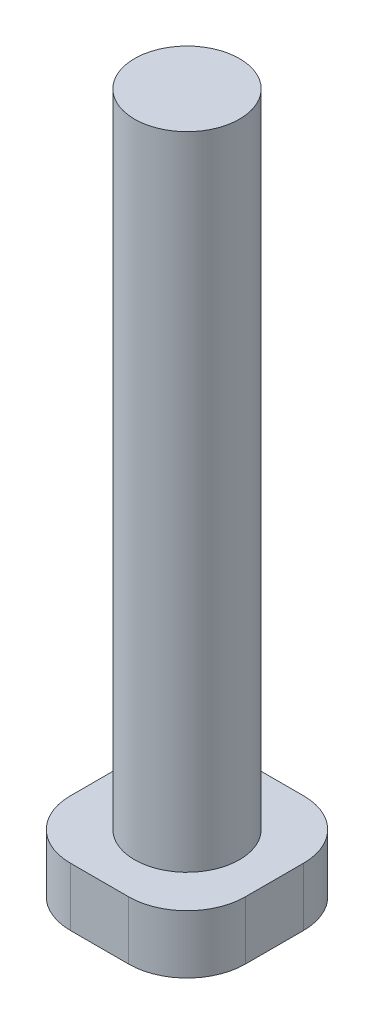
ISO-10303-21;
HEADER;
FILE_DESCRIPTION(('STEP AP214'),'2;1');
FILE_NAME('part.step','',(''),(''),'','','');
FILE_SCHEMA(('AUTOMOTIVE_DESIGN { 1 0 10303 214 1 1 1 1 }'));
ENDSEC;
DATA;
#1=APPLICATION_CONTEXT('core data for automotive mechanical design processes');
#2=APPLICATION_PROTOCOL_DEFINITION('international standard','automotive_design',2000,#1);
#3=PRODUCT_CONTEXT('',#1,'mechanical');
#4=PRODUCT('Part','Part','',(#3));
#5=PRODUCT_RELATED_PRODUCT_CATEGORY('part','',(#4));
#6=PRODUCT_DEFINITION_FORMATION('','',#4);
#7=PRODUCT_DEFINITION_CONTEXT('part definition',#1,'design');
#8=PRODUCT_DEFINITION('design','',#6,#7);
#9=PRODUCT_DEFINITION_SHAPE('','',#8);
#10=(LENGTH_UNIT() NAMED_UNIT(*) SI_UNIT(.MILLI.,.METRE.));
#11=(NAMED_UNIT(*) PLANE_ANGLE_UNIT() SI_UNIT($,.RADIAN.));
#12=(NAMED_UNIT(*) SI_UNIT($,.STERADIAN.) SOLID_ANGLE_UNIT());
#13=UNCERTAINTY_MEASURE_WITH_UNIT(LENGTH_MEASURE(1.E-05),#10,'distance_accuracy_value','');
#14=(GEOMETRIC_REPRESENTATION_CONTEXT(3) GLOBAL_UNCERTAINTY_ASSIGNED_CONTEXT((#13)) GLOBAL_UNIT_ASSIGNED_CONTEXT((#10,
#11,#12)) REPRESENTATION_CONTEXT('',''));
#15=CARTESIAN_POINT('',(0.,0.,0.));
#16=DIRECTION('',(0.,0.,1.));
#17=DIRECTION('',(1.,0.,0.));
#18=AXIS2_PLACEMENT_3D('',#15,#16,#17);
#19=CARTESIAN_POINT('',(0.,30.48,0.));
#20=DIRECTION('',(1.,0.,0.));
#21=DIRECTION('',(0.,0.,-1.));
#22=AXIS2_PLACEMENT_3D('',#19,#20,#21);
#23=PLANE('',#22);
#24=DIRECTION('',(0.,0.,1.));
#25=VECTOR('',#24,1.);
#26=CARTESIAN_POINT('',(0.,2.53999999999999,-7.62));
#27=LINE('',#26,#25);
#28=CARTESIAN_POINT('',(0.,2.53999999999999,-5.08));
#29=VERTEX_POINT('',#28);
#30=CARTESIAN_POINT('',(0.,2.53999999999999,-2.54));
#31=VERTEX_POINT('',#30);
#32=EDGE_CURVE('E182',#29,#31,#27,.T.);
#33=ORIENTED_EDGE('',*,*,#32,.F.);
#34=DIRECTION('',(0.,-1.,0.));
#35=VECTOR('',#34,1.);
#36=CARTESIAN_POINT('',(0.,30.48,-5.08));
#37=LINE('',#36,#35);
#38=CARTESIAN_POINT('',(0.,0.,-5.08));
#39=VERTEX_POINT('',#38);
#40=EDGE_CURVE('E172',#29,#39,#37,.T.);
#41=ORIENTED_EDGE('',*,*,#40,.T.);
#42=DIRECTION('',(0.,0.,1.));
#43=VECTOR('',#42,1.);
#44=CARTESIAN_POINT('',(0.,0.,0.));
#45=LINE('',#44,#43);
#46=CARTESIAN_POINT('',(0.,0.,-2.54));
#47=VERTEX_POINT('',#46);
#48=EDGE_CURVE('E181',#39,#47,#45,.T.);
#49=ORIENTED_EDGE('',*,*,#48,.T.);
#50=DIRECTION('',(0.,-1.,0.));
#51=VECTOR('',#50,1.);
#52=CARTESIAN_POINT('',(0.,30.48,-2.54));
#53=LINE('',#52,#51);
#54=EDGE_CURVE('E165',#47,#31,#53,.F.);
#55=ORIENTED_EDGE('',*,*,#54,.T.);
#56=EDGE_LOOP('',(#33,#41,#49,#55));
#57=FACE_BOUND('',#56,.T.);
#58=ADVANCED_FACE('F39',(#57),#23,.F.);
#59=CARTESIAN_POINT('',(0.,30.48,0.));
#60=DIRECTION('',(0.,0.,-1.));
#61=DIRECTION('',(-1.,0.,0.));
#62=AXIS2_PLACEMENT_3D('',#59,#60,#61);
#63=PLANE('',#62);
#64=DIRECTION('',(1.,0.,0.));
#65=VECTOR('',#64,1.);
#66=CARTESIAN_POINT('',(0.,2.53999999999999,0.));
#67=LINE('',#66,#65);
#68=CARTESIAN_POINT('',(2.54,2.53999999999999,0.));
#69=VERTEX_POINT('',#68);
#70=CARTESIAN_POINT('',(5.08,2.53999999999999,0.));
#71=VERTEX_POINT('',#70);
#72=EDGE_CURVE('E111',#69,#71,#67,.T.);
#73=ORIENTED_EDGE('',*,*,#72,.F.);
#74=DIRECTION('',(0.,-1.,0.));
#75=VECTOR('',#74,1.);
#76=CARTESIAN_POINT('',(2.54,30.48,0.));
#77=LINE('',#76,#75);
#78=CARTESIAN_POINT('',(2.54,0.,0.));
#79=VERTEX_POINT('',#78);
#80=EDGE_CURVE('E157',#69,#79,#77,.T.);
#81=ORIENTED_EDGE('',*,*,#80,.T.);
#82=DIRECTION('',(1.,0.,0.));
#83=VECTOR('',#82,1.);
#84=CARTESIAN_POINT('',(0.,0.,0.));
#85=LINE('',#84,#83);
#86=CARTESIAN_POINT('',(5.08,0.,0.));
#87=VERTEX_POINT('',#86);
#88=EDGE_CURVE('E189',#79,#87,#85,.T.);
#89=ORIENTED_EDGE('',*,*,#88,.T.);
#90=DIRECTION('',(0.,-1.,0.));
#91=VECTOR('',#90,1.);
#92=CARTESIAN_POINT('',(5.08,30.48,0.));
#93=LINE('',#92,#91);
#94=EDGE_CURVE('E118',#87,#71,#93,.F.);
#95=ORIENTED_EDGE('',*,*,#94,.T.);
#96=EDGE_LOOP('',(#73,#81,#89,#95));
#97=FACE_BOUND('',#96,.T.);
#98=ADVANCED_FACE('F208',(#97),#63,.F.);
#99=CARTESIAN_POINT('',(7.62,30.48,0.));
#100=DIRECTION('',(-1.,0.,0.));
#101=DIRECTION('',(0.,0.,1.));
#102=AXIS2_PLACEMENT_3D('',#99,#100,#101);
#103=PLANE('',#102);
#104=DIRECTION('',(0.,0.,-1.));
#105=VECTOR('',#104,1.);
#106=CARTESIAN_POINT('',(7.62,0.,0.));
#107=LINE('',#106,#105);
#108=CARTESIAN_POINT('',(7.62,0.,-2.54));
#109=VERTEX_POINT('',#108);
#110=CARTESIAN_POINT('',(7.62,0.,-5.08));
#111=VERTEX_POINT('',#110);
#112=EDGE_CURVE('E140',#109,#111,#107,.T.);
#113=ORIENTED_EDGE('',*,*,#112,.T.);
#114=DIRECTION('',(0.,-1.,0.));
#115=VECTOR('',#114,1.);
#116=CARTESIAN_POINT('',(7.62,30.48,-5.08));
#117=LINE('',#116,#115);
#118=CARTESIAN_POINT('',(7.62,2.53999999999999,-5.08));
#119=VERTEX_POINT('',#118);
#120=EDGE_CURVE('E127',#111,#119,#117,.F.);
#121=ORIENTED_EDGE('',*,*,#120,.T.);
#122=DIRECTION('',(0.,0.,-1.));
#123=VECTOR('',#122,1.);
#124=CARTESIAN_POINT('',(7.62,2.53999999999999,-7.62));
#125=LINE('',#124,#123);
#126=CARTESIAN_POINT('',(7.62,2.53999999999999,-2.54));
#127=VERTEX_POINT('',#126);
#128=EDGE_CURVE('E108',#127,#119,#125,.T.);
#129=ORIENTED_EDGE('',*,*,#128,.F.);
#130=DIRECTION('',(0.,-1.,0.));
#131=VECTOR('',#130,1.);
#132=CARTESIAN_POINT('',(7.62,30.48,-2.54));
#133=LINE('',#132,#131);
#134=EDGE_CURVE('E124',#127,#109,#133,.T.);
#135=ORIENTED_EDGE('',*,*,#134,.T.);
#136=EDGE_LOOP('',(#113,#121,#129,#135));
#137=FACE_BOUND('',#136,.T.);
#138=ADVANCED_FACE('F123',(#137),#103,.F.);
#139=CARTESIAN_POINT('',(0.,30.48,-7.62));
#140=DIRECTION('',(0.,0.,1.));
#141=DIRECTION('',(1.,0.,0.));
#142=AXIS2_PLACEMENT_3D('',#139,#140,#141);
#143=PLANE('',#142);
#144=DIRECTION('',(-1.,0.,0.));
#145=VECTOR('',#144,1.);
#146=CARTESIAN_POINT('',(0.,0.,-7.62));
#147=LINE('',#146,#145);
#148=CARTESIAN_POINT('',(5.08,0.,-7.62));
#149=VERTEX_POINT('',#148);
#150=CARTESIAN_POINT('',(2.54,0.,-7.62));
#151=VERTEX_POINT('',#150);
#152=EDGE_CURVE('E135',#149,#151,#147,.T.);
#153=ORIENTED_EDGE('',*,*,#152,.T.);
#154=DIRECTION('',(0.,-1.,0.));
#155=VECTOR('',#154,1.);
#156=CARTESIAN_POINT('',(2.54,30.48,-7.62));
#157=LINE('',#156,#155);
#158=CARTESIAN_POINT('',(2.54,2.53999999999999,-7.62));
#159=VERTEX_POINT('',#158);
#160=EDGE_CURVE('E48',#151,#159,#157,.F.);
#161=ORIENTED_EDGE('',*,*,#160,.T.);
#162=DIRECTION('',(-1.,0.,0.));
#163=VECTOR('',#162,1.);
#164=CARTESIAN_POINT('',(0.,2.53999999999999,-7.62));
#165=LINE('',#164,#163);
#166=CARTESIAN_POINT('',(5.08,2.53999999999999,-7.62));
#167=VERTEX_POINT('',#166);
#168=EDGE_CURVE('E129',#167,#159,#165,.T.);
#169=ORIENTED_EDGE('',*,*,#168,.F.);
#170=DIRECTION('',(0.,-1.,0.));
#171=VECTOR('',#170,1.);
#172=CARTESIAN_POINT('',(5.08,30.48,-7.62));
#173=LINE('',#172,#171);
#174=EDGE_CURVE('E117',#167,#149,#173,.T.);
#175=ORIENTED_EDGE('',*,*,#174,.T.);
#176=EDGE_LOOP('',(#153,#161,#169,#175));
#177=FACE_BOUND('',#176,.T.);
#178=ADVANCED_FACE('F199',(#177),#143,.F.);
#179=CARTESIAN_POINT('',(0.,0.,0.));
#180=DIRECTION('',(0.,-1.,0.));
#181=DIRECTION('',(0.,0.,-1.));
#182=AXIS2_PLACEMENT_3D('',#179,#180,#181);
#183=PLANE('',#182);
#184=ORIENTED_EDGE('',*,*,#48,.F.);
#185=CARTESIAN_POINT('',(2.54,0.,-5.08));
#186=DIRECTION('',(0.,-1.,0.));
#187=DIRECTION('',(0.,0.,-1.));
#188=AXIS2_PLACEMENT_3D('',#185,#186,#187);
#189=CIRCLE('',#188,2.54);
#190=EDGE_CURVE('E62',#39,#151,#189,.T.);
#191=ORIENTED_EDGE('',*,*,#190,.T.);
#192=ORIENTED_EDGE('',*,*,#152,.F.);
#193=CARTESIAN_POINT('',(5.08,0.,-5.08));
#194=DIRECTION('',(0.,-1.,0.));
#195=DIRECTION('',(0.,0.,-1.));
#196=AXIS2_PLACEMENT_3D('',#193,#194,#195);
#197=CIRCLE('',#196,2.54);
#198=EDGE_CURVE('E149',#149,#111,#197,.T.);
#199=ORIENTED_EDGE('',*,*,#198,.T.);
#200=ORIENTED_EDGE('',*,*,#112,.F.);
#201=CARTESIAN_POINT('',(5.08,0.,-2.54));
#202=DIRECTION('',(0.,-1.,0.));
#203=DIRECTION('',(0.,0.,-1.));
#204=AXIS2_PLACEMENT_3D('',#201,#202,#203);
#205=CIRCLE('',#204,2.54);
#206=EDGE_CURVE('E133',#109,#87,#205,.T.);
#207=ORIENTED_EDGE('',*,*,#206,.T.);
#208=ORIENTED_EDGE('',*,*,#88,.F.);
#209=CARTESIAN_POINT('',(2.54,0.,-2.54));
#210=DIRECTION('',(0.,-1.,0.));
#211=DIRECTION('',(0.,0.,-1.));
#212=AXIS2_PLACEMENT_3D('',#209,#210,#211);
#213=CIRCLE('',#212,2.54);
#214=EDGE_CURVE('E161',#79,#47,#213,.T.);
#215=ORIENTED_EDGE('',*,*,#214,.T.);
#216=EDGE_LOOP('',(#184,#191,#192,#199,#200,#207,#208,#215));
#217=FACE_BOUND('',#216,.T.);
#218=ADVANCED_FACE('F185',(#217),#183,.T.);
#219=CARTESIAN_POINT('',(0.,2.53999999999999,0.));
#220=DIRECTION('',(0.,1.,0.));
#221=DIRECTION('',(0.,0.,1.));
#222=AXIS2_PLACEMENT_3D('',#219,#220,#221);
#223=PLANE('',#222);
#224=CARTESIAN_POINT('',(3.81,2.53999999999999,-3.81));
#225=DIRECTION('',(0.,1.,0.));
#226=DIRECTION('',(0.,0.,1.));
#227=AXIS2_PLACEMENT_3D('',#224,#225,#226);
#228=CIRCLE('',#227,2.286);
#229=CARTESIAN_POINT('',(3.81,2.53999999999999,-1.524));
#230=VERTEX_POINT('',#229);
#231=EDGE_CURVE('E202',#230,#230,#228,.T.);
#232=ORIENTED_EDGE('',*,*,#231,.F.);
#233=EDGE_LOOP('',(#232));
#234=FACE_BOUND('',#233,.T.);
#235=ORIENTED_EDGE('',*,*,#168,.T.);
#236=CARTESIAN_POINT('',(2.54,2.53999999999999,-5.08));
#237=DIRECTION('',(0.,1.,0.));
#238=DIRECTION('',(0.,0.,1.));
#239=AXIS2_PLACEMENT_3D('',#236,#237,#238);
#240=CIRCLE('',#239,2.54);
#241=EDGE_CURVE('E11',#159,#29,#240,.T.);
#242=ORIENTED_EDGE('',*,*,#241,.T.);
#243=ORIENTED_EDGE('',*,*,#32,.T.);
#244=CARTESIAN_POINT('',(2.54,2.53999999999999,-2.54));
#245=DIRECTION('',(0.,1.,0.));
#246=DIRECTION('',(0.,0.,1.));
#247=AXIS2_PLACEMENT_3D('',#244,#245,#246);
#248=CIRCLE('',#247,2.54);
#249=EDGE_CURVE('E169',#31,#69,#248,.T.);
#250=ORIENTED_EDGE('',*,*,#249,.T.);
#251=ORIENTED_EDGE('',*,*,#72,.T.);
#252=CARTESIAN_POINT('',(5.08,2.53999999999999,-2.54));
#253=DIRECTION('',(0.,1.,0.));
#254=DIRECTION('',(0.,0.,1.));
#255=AXIS2_PLACEMENT_3D('',#252,#253,#254);
#256=CIRCLE('',#255,2.54);
#257=EDGE_CURVE('E105',#71,#127,#256,.T.);
#258=ORIENTED_EDGE('',*,*,#257,.T.);
#259=ORIENTED_EDGE('',*,*,#128,.T.);
#260=CARTESIAN_POINT('',(5.08,2.53999999999999,-5.08));
#261=DIRECTION('',(0.,1.,0.));
#262=DIRECTION('',(0.,0.,1.));
#263=AXIS2_PLACEMENT_3D('',#260,#261,#262);
#264=CIRCLE('',#263,2.54);
#265=EDGE_CURVE('E154',#119,#167,#264,.T.);
#266=ORIENTED_EDGE('',*,*,#265,.T.);
#267=EDGE_LOOP('',(#235,#242,#243,#250,#251,#258,#259,#266));
#268=FACE_BOUND('',#267,.T.);
#269=ADVANCED_FACE('F107',(#234,#268),#223,.T.);
#270=CARTESIAN_POINT('',(3.81,2.53999999999999,-3.81));
#271=DIRECTION('',(0.,1.,0.));
#272=DIRECTION('',(0.,0.,1.));
#273=AXIS2_PLACEMENT_3D('',#270,#271,#272);
#274=CYLINDRICAL_SURFACE('',#273,2.286);
#275=ORIENTED_EDGE('',*,*,#231,.T.);
#276=EDGE_LOOP('',(#275));
#277=FACE_BOUND('',#276,.T.);
#278=CARTESIAN_POINT('',(3.81,30.48,-3.81));
#279=DIRECTION('',(0.,1.,0.));
#280=DIRECTION('',(0.,0.,1.));
#281=AXIS2_PLACEMENT_3D('',#278,#279,#280);
#282=CIRCLE('',#281,2.286);
#283=CARTESIAN_POINT('',(3.81,30.48,-1.524));
#284=VERTEX_POINT('',#283);
#285=EDGE_CURVE('E212',#284,#284,#282,.T.);
#286=ORIENTED_EDGE('',*,*,#285,.F.);
#287=EDGE_LOOP('',(#286));
#288=FACE_BOUND('',#287,.T.);
#289=ADVANCED_FACE('F220',(#277,#288),#274,.T.);
#290=CARTESIAN_POINT('',(0.,30.48,0.));
#291=DIRECTION('',(0.,-1.,0.));
#292=DIRECTION('',(0.,0.,-1.));
#293=AXIS2_PLACEMENT_3D('',#290,#291,#292);
#294=PLANE('',#293);
#295=ORIENTED_EDGE('',*,*,#285,.T.);
#296=EDGE_LOOP('',(#295));
#297=FACE_BOUND('',#296,.T.);
#298=ADVANCED_FACE('F229',(#297),#294,.F.);
#299=CARTESIAN_POINT('',(5.08,30.48,-2.54));
#300=DIRECTION('',(0.,-1.,0.));
#301=DIRECTION('',(0.,0.,-1.));
#302=AXIS2_PLACEMENT_3D('',#299,#300,#301);
#303=CYLINDRICAL_SURFACE('',#302,2.54);
#304=ORIENTED_EDGE('',*,*,#257,.F.);
#305=ORIENTED_EDGE('',*,*,#94,.F.);
#306=ORIENTED_EDGE('',*,*,#206,.F.);
#307=ORIENTED_EDGE('',*,*,#134,.F.);
#308=EDGE_LOOP('',(#304,#305,#306,#307));
#309=FACE_BOUND('',#308,.T.);
#310=ADVANCED_FACE('F131',(#309),#303,.T.);
#311=CARTESIAN_POINT('',(5.08,30.48,-5.08));
#312=DIRECTION('',(0.,-1.,0.));
#313=DIRECTION('',(0.,0.,-1.));
#314=AXIS2_PLACEMENT_3D('',#311,#312,#313);
#315=CYLINDRICAL_SURFACE('',#314,2.54);
#316=ORIENTED_EDGE('',*,*,#265,.F.);
#317=ORIENTED_EDGE('',*,*,#120,.F.);
#318=ORIENTED_EDGE('',*,*,#198,.F.);
#319=ORIENTED_EDGE('',*,*,#174,.F.);
#320=EDGE_LOOP('',(#316,#317,#318,#319));
#321=FACE_BOUND('',#320,.T.);
#322=ADVANCED_FACE('F197',(#321),#315,.T.);
#323=CARTESIAN_POINT('',(2.54,30.48,-2.54));
#324=DIRECTION('',(0.,-1.,0.));
#325=DIRECTION('',(0.,0.,-1.));
#326=AXIS2_PLACEMENT_3D('',#323,#324,#325);
#327=CYLINDRICAL_SURFACE('',#326,2.54);
#328=ORIENTED_EDGE('',*,*,#249,.F.);
#329=ORIENTED_EDGE('',*,*,#54,.F.);
#330=ORIENTED_EDGE('',*,*,#214,.F.);
#331=ORIENTED_EDGE('',*,*,#80,.F.);
#332=EDGE_LOOP('',(#328,#329,#330,#331));
#333=FACE_BOUND('',#332,.T.);
#334=ADVANCED_FACE('F206',(#333),#327,.T.);
#335=CARTESIAN_POINT('',(2.54,30.48,-5.08));
#336=DIRECTION('',(0.,-1.,0.));
#337=DIRECTION('',(0.,0.,-1.));
#338=AXIS2_PLACEMENT_3D('',#335,#336,#337);
#339=CYLINDRICAL_SURFACE('',#338,2.54);
#340=ORIENTED_EDGE('',*,*,#241,.F.);
#341=ORIENTED_EDGE('',*,*,#160,.F.);
#342=ORIENTED_EDGE('',*,*,#190,.F.);
#343=ORIENTED_EDGE('',*,*,#40,.F.);
#344=EDGE_LOOP('',(#340,#341,#342,#343));
#345=FACE_BOUND('',#344,.T.);
#346=ADVANCED_FACE('F41',(#345),#339,.T.);
#347=CLOSED_SHELL('',(#58,#98,#138,#178,#218,#269,#289,#298,#310,#322,#334,#346));
#348=MANIFOLD_SOLID_BREP('B2',#347);
#349=ADVANCED_BREP_SHAPE_REPRESENTATION('',(#18,#348),#14);
#350=SHAPE_DEFINITION_REPRESENTATION(#9,#349);
ENDSEC;
END-ISO-10303-21;
